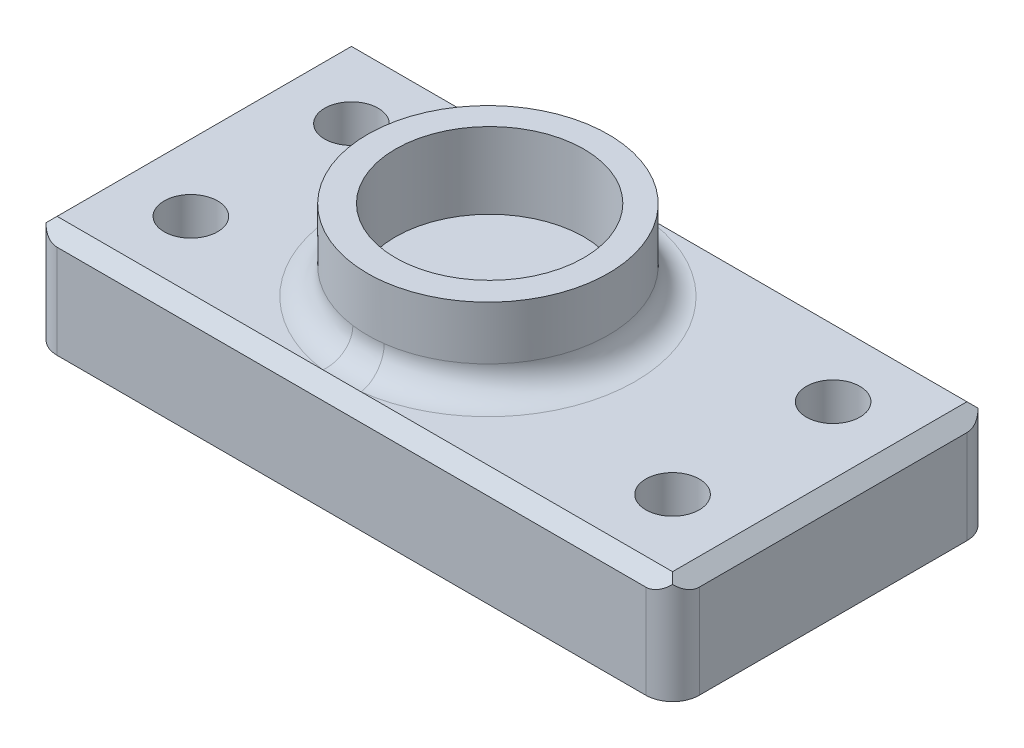
ISO-10303-21;
HEADER;
FILE_DESCRIPTION(('STEP AP214'),'2;1');
FILE_NAME('part.step','',(''),(''),'','','');
FILE_SCHEMA(('AUTOMOTIVE_DESIGN { 1 0 10303 214 1 1 1 1 }'));
ENDSEC;
DATA;
#1=APPLICATION_CONTEXT('core data for automotive mechanical design processes');
#2=APPLICATION_PROTOCOL_DEFINITION('international standard','automotive_design',2000,#1);
#3=PRODUCT_CONTEXT('',#1,'mechanical');
#4=PRODUCT('Part','Part','',(#3));
#5=PRODUCT_RELATED_PRODUCT_CATEGORY('part','',(#4));
#6=PRODUCT_DEFINITION_FORMATION('','',#4);
#7=PRODUCT_DEFINITION_CONTEXT('part definition',#1,'design');
#8=PRODUCT_DEFINITION('design','',#6,#7);
#9=PRODUCT_DEFINITION_SHAPE('','',#8);
#10=(LENGTH_UNIT() NAMED_UNIT(*) SI_UNIT(.MILLI.,.METRE.));
#11=(NAMED_UNIT(*) PLANE_ANGLE_UNIT() SI_UNIT($,.RADIAN.));
#12=(NAMED_UNIT(*) SI_UNIT($,.STERADIAN.) SOLID_ANGLE_UNIT());
#13=UNCERTAINTY_MEASURE_WITH_UNIT(LENGTH_MEASURE(1.E-05),#10,'distance_accuracy_value','');
#14=(GEOMETRIC_REPRESENTATION_CONTEXT(3) GLOBAL_UNCERTAINTY_ASSIGNED_CONTEXT((#13)) GLOBAL_UNIT_ASSIGNED_CONTEXT((#10,
#11,#12)) REPRESENTATION_CONTEXT('',''));
#15=CARTESIAN_POINT('',(0.,0.,0.));
#16=DIRECTION('',(0.,0.,1.));
#17=DIRECTION('',(1.,0.,0.));
#18=AXIS2_PLACEMENT_3D('',#15,#16,#17);
#19=CARTESIAN_POINT('',(-69.4579913046078,25.4,-42.0897293171965));
#20=DIRECTION('',(1.,0.,0.));
#21=DIRECTION('',(0.,0.,-1.));
#22=AXIS2_PLACEMENT_3D('',#19,#20,#21);
#23=PLANE('',#22);
#24=DIRECTION('',(0.,0.,-1.));
#25=VECTOR('',#24,1.);
#26=CARTESIAN_POINT('',(-69.4579913046078,22.225,-42.0897293171965));
#27=LINE('',#26,#25);
#28=CARTESIAN_POINT('',(-69.4579913046078,22.225,27.7602706828035));
#29=VERTEX_POINT('',#28);
#30=CARTESIAN_POINT('',(-69.4579913046078,22.225,-35.7397293171965));
#31=VERTEX_POINT('',#30);
#32=EDGE_CURVE('E185',#29,#31,#27,.T.);
#33=ORIENTED_EDGE('',*,*,#32,.T.);
#34=DIRECTION('',(0.,-1.,0.));
#35=VECTOR('',#34,1.);
#36=CARTESIAN_POINT('',(-69.4579913046078,25.4,-35.7397293171965));
#37=LINE('',#36,#35);
#38=CARTESIAN_POINT('',(-69.4579913046078,0.,-35.7397293171965));
#39=VERTEX_POINT('',#38);
#40=EDGE_CURVE('E318',#31,#39,#37,.T.);
#41=ORIENTED_EDGE('',*,*,#40,.T.);
#42=DIRECTION('',(0.,0.,1.));
#43=VECTOR('',#42,1.);
#44=CARTESIAN_POINT('',(-69.4579913046078,0.,-42.0897293171965));
#45=LINE('',#44,#43);
#46=CARTESIAN_POINT('',(-69.4579913046078,0.,27.7602706828034));
#47=VERTEX_POINT('',#46);
#48=EDGE_CURVE('E384',#39,#47,#45,.T.);
#49=ORIENTED_EDGE('',*,*,#48,.T.);
#50=DIRECTION('',(0.,-1.,0.));
#51=VECTOR('',#50,1.);
#52=CARTESIAN_POINT('',(-69.4579913046078,25.4,27.7602706828035));
#53=LINE('',#52,#51);
#54=EDGE_CURVE('E321',#47,#29,#53,.F.);
#55=ORIENTED_EDGE('',*,*,#54,.T.);
#56=EDGE_LOOP('',(#33,#41,#49,#55));
#57=FACE_BOUND('',#56,.T.);
#58=ADVANCED_FACE('F45',(#57),#23,.F.);
#59=CARTESIAN_POINT('',(-69.4579913046078,25.4,34.1102706828035));
#60=DIRECTION('',(0.,0.,-1.));
#61=DIRECTION('',(-1.,0.,0.));
#62=AXIS2_PLACEMENT_3D('',#59,#60,#61);
#63=PLANE('',#62);
#64=DIRECTION('',(-1.,0.,0.));
#65=VECTOR('',#64,1.);
#66=CARTESIAN_POINT('',(-69.4579913046078,22.225,34.1102706828035));
#67=LINE('',#66,#65);
#68=CARTESIAN_POINT('',(76.5920086953922,22.225,34.1102706828035));
#69=VERTEX_POINT('',#68);
#70=CARTESIAN_POINT('',(-63.1079913046079,22.225,34.1102706828035));
#71=VERTEX_POINT('',#70);
#72=EDGE_CURVE('E202',#69,#71,#67,.T.);
#73=ORIENTED_EDGE('',*,*,#72,.T.);
#74=DIRECTION('',(0.,-1.,0.));
#75=VECTOR('',#74,1.);
#76=CARTESIAN_POINT('',(-63.1079913046079,25.4,34.1102706828035));
#77=LINE('',#76,#75);
#78=CARTESIAN_POINT('',(-63.1079913046079,0.,34.1102706828035));
#79=VERTEX_POINT('',#78);
#80=EDGE_CURVE('E307',#71,#79,#77,.T.);
#81=ORIENTED_EDGE('',*,*,#80,.T.);
#82=DIRECTION('',(1.,0.,0.));
#83=VECTOR('',#82,1.);
#84=CARTESIAN_POINT('',(-69.4579913046078,0.,34.1102706828035));
#85=LINE('',#84,#83);
#86=CARTESIAN_POINT('',(76.5920086953921,0.,34.1102706828035));
#87=VERTEX_POINT('',#86);
#88=EDGE_CURVE('E390',#79,#87,#85,.T.);
#89=ORIENTED_EDGE('',*,*,#88,.T.);
#90=DIRECTION('',(0.,-1.,0.));
#91=VECTOR('',#90,1.);
#92=CARTESIAN_POINT('',(76.5920086953922,25.4,34.1102706828035));
#93=LINE('',#92,#91);
#94=EDGE_CURVE('E74',#87,#69,#93,.F.);
#95=ORIENTED_EDGE('',*,*,#94,.T.);
#96=EDGE_LOOP('',(#73,#81,#89,#95));
#97=FACE_BOUND('',#96,.T.);
#98=ADVANCED_FACE('F421',(#97),#63,.F.);
#99=CARTESIAN_POINT('',(82.9420086953922,25.4,-42.0897293171965));
#100=DIRECTION('',(-1.,0.,0.));
#101=DIRECTION('',(0.,0.,1.));
#102=AXIS2_PLACEMENT_3D('',#99,#100,#101);
#103=PLANE('',#102);
#104=DIRECTION('',(0.,0.,-1.));
#105=VECTOR('',#104,1.);
#106=CARTESIAN_POINT('',(82.9420086953922,0.,-42.0897293171965));
#107=LINE('',#106,#105);
#108=CARTESIAN_POINT('',(82.9420086953922,0.,27.7602706828034));
#109=VERTEX_POINT('',#108);
#110=CARTESIAN_POINT('',(82.9420086953922,0.,-35.7397293171965));
#111=VERTEX_POINT('',#110);
#112=EDGE_CURVE('E393',#109,#111,#107,.T.);
#113=ORIENTED_EDGE('',*,*,#112,.T.);
#114=DIRECTION('',(0.,-1.,0.));
#115=VECTOR('',#114,1.);
#116=CARTESIAN_POINT('',(82.9420086953922,25.4,-35.7397293171965));
#117=LINE('',#116,#115);
#118=CARTESIAN_POINT('',(82.9420086953922,22.225,-35.7397293171965));
#119=VERTEX_POINT('',#118);
#120=EDGE_CURVE('E239',#111,#119,#117,.F.);
#121=ORIENTED_EDGE('',*,*,#120,.T.);
#122=DIRECTION('',(0.,0.,1.));
#123=VECTOR('',#122,1.);
#124=CARTESIAN_POINT('',(82.9420086953922,22.225,34.1102706828035));
#125=LINE('',#124,#123);
#126=CARTESIAN_POINT('',(82.9420086953922,22.225,27.7602706828035));
#127=VERTEX_POINT('',#126);
#128=EDGE_CURVE('E198',#119,#127,#125,.T.);
#129=ORIENTED_EDGE('',*,*,#128,.T.);
#130=DIRECTION('',(0.,-1.,0.));
#131=VECTOR('',#130,1.);
#132=CARTESIAN_POINT('',(82.9420086953922,25.4,27.7602706828035));
#133=LINE('',#132,#131);
#134=EDGE_CURVE('E235',#127,#109,#133,.T.);
#135=ORIENTED_EDGE('',*,*,#134,.T.);
#136=EDGE_LOOP('',(#113,#121,#129,#135));
#137=FACE_BOUND('',#136,.T.);
#138=ADVANCED_FACE('F427',(#137),#103,.F.);
#139=CARTESIAN_POINT('',(-69.4579913046078,25.4,-42.0897293171965));
#140=DIRECTION('',(0.,0.,1.));
#141=DIRECTION('',(1.,0.,0.));
#142=AXIS2_PLACEMENT_3D('',#139,#140,#141);
#143=PLANE('',#142);
#144=DIRECTION('',(1.,0.,0.));
#145=VECTOR('',#144,1.);
#146=CARTESIAN_POINT('',(82.9420086953922,22.225,-42.0897293171965));
#147=LINE('',#146,#145);
#148=CARTESIAN_POINT('',(-63.1079913046079,22.225,-42.0897293171965));
#149=VERTEX_POINT('',#148);
#150=CARTESIAN_POINT('',(76.5920086953922,22.225,-42.0897293171965));
#151=VERTEX_POINT('',#150);
#152=EDGE_CURVE('E190',#149,#151,#147,.T.);
#153=ORIENTED_EDGE('',*,*,#152,.T.);
#154=DIRECTION('',(0.,-1.,0.));
#155=VECTOR('',#154,1.);
#156=CARTESIAN_POINT('',(76.5920086953922,25.4,-42.0897293171965));
#157=LINE('',#156,#155);
#158=CARTESIAN_POINT('',(76.5920086953921,0.,-42.0897293171965));
#159=VERTEX_POINT('',#158);
#160=EDGE_CURVE('E219',#151,#159,#157,.T.);
#161=ORIENTED_EDGE('',*,*,#160,.T.);
#162=DIRECTION('',(-1.,0.,0.));
#163=VECTOR('',#162,1.);
#164=CARTESIAN_POINT('',(-69.4579913046078,0.,-42.0897293171965));
#165=LINE('',#164,#163);
#166=CARTESIAN_POINT('',(-63.1079913046079,0.,-42.0897293171965));
#167=VERTEX_POINT('',#166);
#168=EDGE_CURVE('E334',#159,#167,#165,.T.);
#169=ORIENTED_EDGE('',*,*,#168,.T.);
#170=DIRECTION('',(0.,-1.,0.));
#171=VECTOR('',#170,1.);
#172=CARTESIAN_POINT('',(-63.1079913046079,25.4,-42.0897293171965));
#173=LINE('',#172,#171);
#174=EDGE_CURVE('E204',#167,#149,#173,.F.);
#175=ORIENTED_EDGE('',*,*,#174,.T.);
#176=EDGE_LOOP('',(#153,#161,#169,#175));
#177=FACE_BOUND('',#176,.T.);
#178=ADVANCED_FACE('F433',(#177),#143,.F.);
#179=CARTESIAN_POINT('',(0.,25.4,0.));
#180=DIRECTION('',(0.,1.,0.));
#181=DIRECTION('',(0.,0.,1.));
#182=AXIS2_PLACEMENT_3D('',#179,#180,#181);
#183=PLANE('',#182);
#184=DIRECTION('',(1.,0.,0.));
#185=VECTOR('',#184,1.);
#186=CARTESIAN_POINT('',(82.9420086953922,25.4,30.9352706828035));
#187=LINE('',#186,#185);
#188=CARTESIAN_POINT('',(-66.2829913046078,25.4,30.9352706828035));
#189=VERTEX_POINT('',#188);
#190=CARTESIAN_POINT('',(-3.21481026973823,25.4,30.9352706828035));
#191=VERTEX_POINT('',#190);
#192=EDGE_CURVE('E169',#189,#191,#187,.T.);
#193=ORIENTED_EDGE('',*,*,#192,.T.);
#194=CARTESIAN_POINT('',(1.32772290289185,25.4,-3.69305612308706));
#195=DIRECTION('',(0.,1.,0.));
#196=DIRECTION('',(0.,0.,1.));
#197=AXIS2_PLACEMENT_3D('',#194,#195,#196);
#198=CIRCLE('',#197,34.925);
#199=CARTESIAN_POINT('',(5.87025607552193,25.4,30.9352706828035));
#200=VERTEX_POINT('',#199);
#201=EDGE_CURVE('E267',#191,#200,#198,.F.);
#202=ORIENTED_EDGE('',*,*,#201,.T.);
#203=CARTESIAN_POINT('',(79.7670086953921,25.4,30.9352706828035));
#204=VERTEX_POINT('',#203);
#205=EDGE_CURVE('E178',#200,#204,#187,.T.);
#206=ORIENTED_EDGE('',*,*,#205,.T.);
#207=DIRECTION('',(0.,0.,-1.));
#208=VECTOR('',#207,1.);
#209=CARTESIAN_POINT('',(79.7670086953921,25.4,-42.0897293171965));
#210=LINE('',#209,#208);
#211=CARTESIAN_POINT('',(79.7670086953921,25.4,-38.9147293171965));
#212=VERTEX_POINT('',#211);
#213=EDGE_CURVE('E176',#204,#212,#210,.T.);
#214=ORIENTED_EDGE('',*,*,#213,.T.);
#215=DIRECTION('',(-1.,0.,0.));
#216=VECTOR('',#215,1.);
#217=CARTESIAN_POINT('',(-69.4579913046078,25.4,-38.9147293171965));
#218=LINE('',#217,#216);
#219=CARTESIAN_POINT('',(-66.2829913046078,25.4,-38.9147293171965));
#220=VERTEX_POINT('',#219);
#221=EDGE_CURVE('E182',#212,#220,#218,.T.);
#222=ORIENTED_EDGE('',*,*,#221,.T.);
#223=DIRECTION('',(0.,0.,1.));
#224=VECTOR('',#223,1.);
#225=CARTESIAN_POINT('',(-66.2829913046078,25.4,34.1102706828035));
#226=LINE('',#225,#224);
#227=EDGE_CURVE('E159',#220,#189,#226,.T.);
#228=ORIENTED_EDGE('',*,*,#227,.T.);
#229=EDGE_LOOP('',(#193,#202,#206,#214,#222,#228));
#230=FACE_BOUND('',#229,.T.);
#231=CARTESIAN_POINT('',(-50.4079913046079,25.4,15.0602706828035));
#232=DIRECTION('',(0.,1.,0.));
#233=DIRECTION('',(0.,0.,1.));
#234=AXIS2_PLACEMENT_3D('',#231,#232,#233);
#235=CIRCLE('',#234,6.35);
#236=CARTESIAN_POINT('',(-50.4079913046079,25.4,21.4102706828035));
#237=VERTEX_POINT('',#236);
#238=EDGE_CURVE('E369',#237,#237,#235,.T.);
#239=ORIENTED_EDGE('',*,*,#238,.F.);
#240=EDGE_LOOP('',(#239));
#241=FACE_BOUND('',#240,.T.);
#242=CARTESIAN_POINT('',(63.8920086953922,25.4,-23.0397293171965));
#243=DIRECTION('',(0.,1.,0.));
#244=DIRECTION('',(0.,0.,1.));
#245=AXIS2_PLACEMENT_3D('',#242,#243,#244);
#246=CIRCLE('',#245,6.35);
#247=CARTESIAN_POINT('',(63.8920086953922,25.4,-16.6897293171965));
#248=VERTEX_POINT('',#247);
#249=EDGE_CURVE('E362',#248,#248,#246,.T.);
#250=ORIENTED_EDGE('',*,*,#249,.F.);
#251=EDGE_LOOP('',(#250));
#252=FACE_BOUND('',#251,.T.);
#253=CARTESIAN_POINT('',(63.8920086953922,25.4,15.0602706828035));
#254=DIRECTION('',(0.,1.,0.));
#255=DIRECTION('',(0.,0.,1.));
#256=AXIS2_PLACEMENT_3D('',#253,#254,#255);
#257=CIRCLE('',#256,6.35);
#258=CARTESIAN_POINT('',(63.8920086953922,25.4,21.4102706828035));
#259=VERTEX_POINT('',#258);
#260=EDGE_CURVE('E348',#259,#259,#257,.T.);
#261=ORIENTED_EDGE('',*,*,#260,.F.);
#262=EDGE_LOOP('',(#261));
#263=FACE_BOUND('',#262,.T.);
#264=CARTESIAN_POINT('',(-50.4079913046079,25.4,-23.0397293171965));
#265=DIRECTION('',(0.,1.,0.));
#266=DIRECTION('',(0.,0.,1.));
#267=AXIS2_PLACEMENT_3D('',#264,#265,#266);
#268=CIRCLE('',#267,6.35);
#269=CARTESIAN_POINT('',(-50.4079913046079,25.4,-16.6897293171965));
#270=VERTEX_POINT('',#269);
#271=EDGE_CURVE('E368',#270,#270,#268,.T.);
#272=ORIENTED_EDGE('',*,*,#271,.F.);
#273=EDGE_LOOP('',(#272));
#274=FACE_BOUND('',#273,.T.);
#275=ADVANCED_FACE('F179',(#230,#241,#252,#263,#274),#183,.T.);
#276=CARTESIAN_POINT('',(0.,0.,0.));
#277=DIRECTION('',(0.,1.,0.));
#278=DIRECTION('',(0.,0.,1.));
#279=AXIS2_PLACEMENT_3D('',#276,#277,#278);
#280=PLANE('',#279);
#281=CARTESIAN_POINT('',(-50.4079913046079,0.,15.0602706828035));
#282=DIRECTION('',(0.,1.,0.));
#283=DIRECTION('',(0.,0.,1.));
#284=AXIS2_PLACEMENT_3D('',#281,#282,#283);
#285=CIRCLE('',#284,6.35);
#286=CARTESIAN_POINT('',(-50.4079913046079,0.,21.4102706828035));
#287=VERTEX_POINT('',#286);
#288=EDGE_CURVE('E364',#287,#287,#285,.T.);
#289=ORIENTED_EDGE('',*,*,#288,.T.);
#290=EDGE_LOOP('',(#289));
#291=FACE_BOUND('',#290,.T.);
#292=CARTESIAN_POINT('',(63.8920086953922,0.,-23.0397293171965));
#293=DIRECTION('',(0.,1.,0.));
#294=DIRECTION('',(0.,0.,1.));
#295=AXIS2_PLACEMENT_3D('',#292,#293,#294);
#296=CIRCLE('',#295,6.35);
#297=CARTESIAN_POINT('',(63.8920086953922,0.,-16.6897293171965));
#298=VERTEX_POINT('',#297);
#299=EDGE_CURVE('E373',#298,#298,#296,.T.);
#300=ORIENTED_EDGE('',*,*,#299,.T.);
#301=EDGE_LOOP('',(#300));
#302=FACE_BOUND('',#301,.T.);
#303=CARTESIAN_POINT('',(63.8920086953922,0.,15.0602706828035));
#304=DIRECTION('',(0.,1.,0.));
#305=DIRECTION('',(0.,0.,1.));
#306=AXIS2_PLACEMENT_3D('',#303,#304,#305);
#307=CIRCLE('',#306,6.35);
#308=CARTESIAN_POINT('',(63.8920086953922,0.,21.4102706828035));
#309=VERTEX_POINT('',#308);
#310=EDGE_CURVE('E354',#309,#309,#307,.T.);
#311=ORIENTED_EDGE('',*,*,#310,.T.);
#312=EDGE_LOOP('',(#311));
#313=FACE_BOUND('',#312,.T.);
#314=CARTESIAN_POINT('',(-50.4079913046079,0.,-23.0397293171965));
#315=DIRECTION('',(0.,1.,0.));
#316=DIRECTION('',(0.,0.,1.));
#317=AXIS2_PLACEMENT_3D('',#314,#315,#316);
#318=CIRCLE('',#317,6.35);
#319=CARTESIAN_POINT('',(-50.4079913046079,0.,-16.6897293171965));
#320=VERTEX_POINT('',#319);
#321=EDGE_CURVE('E380',#320,#320,#318,.T.);
#322=ORIENTED_EDGE('',*,*,#321,.T.);
#323=EDGE_LOOP('',(#322));
#324=FACE_BOUND('',#323,.T.);
#325=ORIENTED_EDGE('',*,*,#168,.F.);
#326=CARTESIAN_POINT('',(76.5920086953922,0.,-35.7397293171965));
#327=DIRECTION('',(0.,1.,0.));
#328=DIRECTION('',(0.,0.,1.));
#329=AXIS2_PLACEMENT_3D('',#326,#327,#328);
#330=CIRCLE('',#329,6.35);
#331=EDGE_CURVE('E232',#159,#111,#330,.F.);
#332=ORIENTED_EDGE('',*,*,#331,.T.);
#333=ORIENTED_EDGE('',*,*,#112,.F.);
#334=CARTESIAN_POINT('',(76.5920086953922,0.,27.7602706828035));
#335=DIRECTION('',(0.,1.,0.));
#336=DIRECTION('',(0.,0.,1.));
#337=AXIS2_PLACEMENT_3D('',#334,#335,#336);
#338=CIRCLE('',#337,6.35);
#339=EDGE_CURVE('E223',#109,#87,#338,.F.);
#340=ORIENTED_EDGE('',*,*,#339,.T.);
#341=ORIENTED_EDGE('',*,*,#88,.F.);
#342=CARTESIAN_POINT('',(-63.1079913046079,0.,27.7602706828035));
#343=DIRECTION('',(0.,1.,0.));
#344=DIRECTION('',(0.,0.,1.));
#345=AXIS2_PLACEMENT_3D('',#342,#343,#344);
#346=CIRCLE('',#345,6.35);
#347=EDGE_CURVE('E226',#79,#47,#346,.F.);
#348=ORIENTED_EDGE('',*,*,#347,.T.);
#349=ORIENTED_EDGE('',*,*,#48,.F.);
#350=CARTESIAN_POINT('',(-63.1079913046079,0.,-35.7397293171965));
#351=DIRECTION('',(0.,1.,0.));
#352=DIRECTION('',(0.,0.,1.));
#353=AXIS2_PLACEMENT_3D('',#350,#351,#352);
#354=CIRCLE('',#353,6.35);
#355=EDGE_CURVE('E229',#39,#167,#354,.F.);
#356=ORIENTED_EDGE('',*,*,#355,.T.);
#357=EDGE_LOOP('',(#325,#332,#333,#340,#341,#348,#349,#356));
#358=FACE_BOUND('',#357,.T.);
#359=ADVANCED_FACE('F416',(#291,#302,#313,#324,#358),#280,.F.);
#360=CARTESIAN_POINT('',(-50.4079913046079,0.,-23.0397293171965));
#361=DIRECTION('',(0.,1.,0.));
#362=DIRECTION('',(0.,0.,1.));
#363=AXIS2_PLACEMENT_3D('',#360,#361,#362);
#364=CYLINDRICAL_SURFACE('',#363,6.35);
#365=ORIENTED_EDGE('',*,*,#321,.F.);
#366=EDGE_LOOP('',(#365));
#367=FACE_BOUND('',#366,.T.);
#368=ORIENTED_EDGE('',*,*,#271,.T.);
#369=EDGE_LOOP('',(#368));
#370=FACE_BOUND('',#369,.T.);
#371=ADVANCED_FACE('F533',(#367,#370),#364,.F.);
#372=CARTESIAN_POINT('',(63.8920086953922,0.,15.0602706828035));
#373=DIRECTION('',(0.,1.,0.));
#374=DIRECTION('',(0.,0.,1.));
#375=AXIS2_PLACEMENT_3D('',#372,#373,#374);
#376=CYLINDRICAL_SURFACE('',#375,6.35);
#377=ORIENTED_EDGE('',*,*,#310,.F.);
#378=EDGE_LOOP('',(#377));
#379=FACE_BOUND('',#378,.T.);
#380=ORIENTED_EDGE('',*,*,#260,.T.);
#381=EDGE_LOOP('',(#380));
#382=FACE_BOUND('',#381,.T.);
#383=ADVANCED_FACE('F555',(#379,#382),#376,.F.);
#384=CARTESIAN_POINT('',(63.8920086953922,0.,-23.0397293171965));
#385=DIRECTION('',(0.,1.,0.));
#386=DIRECTION('',(0.,0.,1.));
#387=AXIS2_PLACEMENT_3D('',#384,#385,#386);
#388=CYLINDRICAL_SURFACE('',#387,6.35);
#389=ORIENTED_EDGE('',*,*,#299,.F.);
#390=EDGE_LOOP('',(#389));
#391=FACE_BOUND('',#390,.T.);
#392=ORIENTED_EDGE('',*,*,#249,.T.);
#393=EDGE_LOOP('',(#392));
#394=FACE_BOUND('',#393,.T.);
#395=ADVANCED_FACE('F563',(#391,#394),#388,.F.);
#396=CARTESIAN_POINT('',(-50.4079913046079,0.,15.0602706828035));
#397=DIRECTION('',(0.,1.,0.));
#398=DIRECTION('',(0.,0.,1.));
#399=AXIS2_PLACEMENT_3D('',#396,#397,#398);
#400=CYLINDRICAL_SURFACE('',#399,6.35);
#401=ORIENTED_EDGE('',*,*,#288,.F.);
#402=EDGE_LOOP('',(#401));
#403=FACE_BOUND('',#402,.T.);
#404=ORIENTED_EDGE('',*,*,#238,.T.);
#405=EDGE_LOOP('',(#404));
#406=FACE_BOUND('',#405,.T.);
#407=ADVANCED_FACE('F342',(#403,#406),#400,.F.);
#408=CARTESIAN_POINT('',(1.32772290289185,44.45,-3.69305612308706));
#409=DIRECTION('',(0.,-1.,0.));
#410=DIRECTION('',(0.,0.,-1.));
#411=AXIS2_PLACEMENT_3D('',#408,#409,#410);
#412=CYLINDRICAL_SURFACE('',#411,28.575);
#413=CARTESIAN_POINT('',(1.32772290289185,31.75,-3.69305612308706));
#414=DIRECTION('',(0.,1.,0.));
#415=DIRECTION('',(0.,0.,1.));
#416=AXIS2_PLACEMENT_3D('',#413,#414,#415);
#417=CIRCLE('',#416,28.575);
#418=CARTESIAN_POINT('',(5.04434095322555,31.75,24.6392112635506));
#419=VERTEX_POINT('',#418);
#420=CARTESIAN_POINT('',(-2.38889514744186,31.75,24.6392112635506));
#421=VERTEX_POINT('',#420);
#422=EDGE_CURVE('E254',#419,#421,#417,.T.);
#423=ORIENTED_EDGE('',*,*,#422,.T.);
#424=CARTESIAN_POINT('',(-6.2624174510975,31.6773304826748,23.8554537169522));
#425=CARTESIAN_POINT('',(-5.97536421889927,24.3316829936399,23.9345423621858));
#426=CARTESIAN_POINT('',(-7.94911530753958,25.4,30.9352706828035));
#427=CARTESIAN_POINT('',(-5.87897522306729,31.6969180649296,23.9611087342384));
#428=CARTESIAN_POINT('',(-5.65392009005018,24.4903819957808,24.0190937761306));
#429=CARTESIAN_POINT('',(-7.48046369548943,25.4,30.9352706828035));
#430=CARTESIAN_POINT('',(-5.49319688214355,31.7111749942436,24.0587757113627));
#431=CARTESIAN_POINT('',(-5.31409674128743,24.6324543772818,24.1023656961951));
#432=CARTESIAN_POINT('',(-7.0089568343659,25.4,30.9352706828035));
#433=CARTESIAN_POINT('',(-4.71780957692108,31.7320174591437,24.2379361999547));
#434=CARTESIAN_POINT('',(-4.61339676458064,24.8834331189676,24.2598964434049));
#435=CARTESIAN_POINT('',(-6.06126123911103,25.4,30.9352706828035));
#436=CARTESIAN_POINT('',(-4.32820109742514,31.738603953328,24.319431731362));
#437=CARTESIAN_POINT('',(-4.25172293059041,24.993357289891,24.3345817753255));
#438=CARTESIAN_POINT('',(-5.58507309751645,25.4,30.9352706828035));
#439=CARTESIAN_POINT('',(-3.54602670304103,31.7470974729515,24.4660544840629));
#440=CARTESIAN_POINT('',(-3.51338816496298,25.1848369432757,24.4713706097458));
#441=CARTESIAN_POINT('',(-4.62908217104482,25.4,30.9352706828035));
#442=CARTESIAN_POINT('',(-3.15346179628641,31.7490060269875,24.5311870459905));
#443=CARTESIAN_POINT('',(-3.13574895486982,25.2671152463945,24.5338787234635));
#444=CARTESIAN_POINT('',(-4.14928061833103,25.4,30.9352706828035));
#445=CARTESIAN_POINT('',(-2.36594168828603,31.7503793165608,24.6450056385877));
#446=CARTESIAN_POINT('',(-2.36997578815105,25.4072464534914,24.6442923578275));
#447=CARTESIAN_POINT('',(-3.1867560418761,25.4,30.9352706828035));
#448=CARTESIAN_POINT('',(-1.97098642254757,31.7498439858652,24.6936912234808));
#449=CARTESIAN_POINT('',(-1.98074020288179,25.465585267753,24.6925306363788));
#450=CARTESIAN_POINT('',(-2.70403293931056,25.4,30.9352706828035));
#451=CARTESIAN_POINT('',(-1.19006502128749,31.7480616416417,24.7734371989972));
#452=CARTESIAN_POINT('',(-1.20616339669828,25.5593959322419,24.7719521892761));
#453=CARTESIAN_POINT('',(-1.74957344888418,25.4,30.9352706828035));
#454=CARTESIAN_POINT('',(-0.804143676874773,31.7468342082833,24.8049374611878));
#455=CARTESIAN_POINT('',(-0.819980428479548,25.5957243987229,24.8037830311191));
#456=CARTESIAN_POINT('',(-1.27789180571214,25.4,30.9352706828035));
#457=CARTESIAN_POINT('',(-0.0313392820995467,31.7447264656545,24.8522313725286));
#458=CARTESIAN_POINT('',(-0.0444463636128284,25.6496880404032,24.8516136854666));
#459=CARTESIAN_POINT('',(-0.333353100986178,25.4,30.9352706828035));
#460=CARTESIAN_POINT('',(0.355543765570938,31.7438461554135,24.8680250655957));
#461=CARTESIAN_POINT('',(0.346025655893967,25.6674844176349,24.8677531337672));
#462=CARTESIAN_POINT('',(0.139503957277492,25.4,30.9352706828035));
#463=CARTESIAN_POINT('',(1.12968410060868,31.742962138183,24.8838805920441));
#464=CARTESIAN_POINT('',(1.12729656094165,25.6852978052027,24.8839085759515));
#465=CARTESIAN_POINT('',(1.08567547787899,25.4,30.9352706828035));
#466=CARTESIAN_POINT('',(1.51694143078748,31.7429585474137,24.8839403396923));
#467=CARTESIAN_POINT('',(1.51923513073107,25.6853645966855,24.8839697161849));
#468=CARTESIAN_POINT('',(1.55898999254204,25.4,30.9352706828035));
#469=CARTESIAN_POINT('',(2.29114180001205,31.743829807023,24.8683226707549));
#470=CARTESIAN_POINT('',(2.30058306775974,25.6678194688899,24.8680564581964));
#471=CARTESIAN_POINT('',(2.505234888261,25.4,30.9352706828035));
#472=CARTESIAN_POINT('',(2.67808483557132,31.7447046670167,24.8526450819167));
#473=CARTESIAN_POINT('',(2.69113214362619,25.6501560060338,24.8520353088157));
#474=CARTESIAN_POINT('',(2.97816526505564,25.4,30.9352706828035));
#475=CARTESIAN_POINT('',(3.4559451287158,31.7468223521233,24.80527808872));
#476=CARTESIAN_POINT('',(3.47181187615464,25.5961167401157,24.8041239859989));
#477=CARTESIAN_POINT('',(3.92888340112113,25.4,30.9352706828035));
#478=CARTESIAN_POINT('',(3.84685010681386,31.748069729409,24.7733869541687));
#479=CARTESIAN_POINT('',(3.86300931535137,25.5593408893904,24.7718916854723));
#480=CARTESIAN_POINT('',(4.40665615212991,25.4,30.9352706828035));
#481=CARTESIAN_POINT('',(4.62701203048033,31.7498401837904,24.6935440901727));
#482=CARTESIAN_POINT('',(4.63668832339258,25.4654071876209,24.6923941205265));
#483=CARTESIAN_POINT('',(5.36018739216662,25.4,30.9352706828035));
#484=CARTESIAN_POINT('',(5.01626899928674,31.7503632711331,24.6455925879583));
#485=CARTESIAN_POINT('',(5.02029423554921,25.4079502681124,24.6448925563951));
#486=CARTESIAN_POINT('',(5.83594590959654,25.4,30.9352706828035));
#487=CARTESIAN_POINT('',(5.79233621489822,31.7490591416498,24.5337306515451));
#488=CARTESIAN_POINT('',(5.77509778759244,25.2702912785221,24.5363364724679));
#489=CARTESIAN_POINT('',(6.78447250645536,25.4,30.9352706828035));
#490=CARTESIAN_POINT('',(6.17914731455322,31.7472327952923,24.4698261350292));
#491=CARTESIAN_POINT('',(6.1473555860616,25.1896336656075,24.4749686764486));
#492=CARTESIAN_POINT('',(7.25724162825639,25.4,30.9352706828035));
#493=CARTESIAN_POINT('',(6.9497806385726,31.7390718563811,24.3261643892461));
#494=CARTESIAN_POINT('',(6.87540278363419,25.0023242646615,24.3408251578426));
#495=CARTESIAN_POINT('',(8.19912680205659,25.4,30.9352706828035));
#496=CARTESIAN_POINT('',(7.33360291025067,31.7327373353399,24.2464074114586));
#497=CARTESIAN_POINT('',(7.23213731699184,24.8949965044059,24.2676685270362));
#498=CARTESIAN_POINT('',(8.66824291188361,25.4,30.9352706828035));
#499=CARTESIAN_POINT('',(8.10856870166042,31.7125654088884,24.0686676741575));
#500=CARTESIAN_POINT('',(7.93409390168224,24.646628814737,24.1107893523732));
#501=CARTESIAN_POINT('',(9.61542332361143,25.4,30.9352706828035));
#502=CARTESIAN_POINT('',(8.4996036316854,31.6985166522143,23.9702251686631));
#503=CARTESIAN_POINT('',(8.27933290626452,24.5037408102853,24.0264224912211));
#504=CARTESIAN_POINT('',(10.0933549047598,25.4,30.9352706828035));
#505=CARTESIAN_POINT('',(9.27673909021559,31.6591732625174,23.7570092124321));
#506=CARTESIAN_POINT('',(8.93932491644969,24.1807532934001,23.8539145459824));
#507=CARTESIAN_POINT('',(11.0431871318364,25.4,30.9352706828035));
#508=CARTESIAN_POINT('',(9.66284064214823,31.6338810022404,23.6422392108024));
#509=CARTESIAN_POINT('',(9.25462398674387,23.9991988806855,23.7653632065693));
#510=CARTESIAN_POINT('',(11.5150890286202,25.4,30.9352706828035));
#511=CARTESIAN_POINT('',(10.4298562800269,31.5675992244602,23.396502918816));
#512=CARTESIAN_POINT('',(9.84527663439941,23.5922169950679,23.5916734976476));
#513=CARTESIAN_POINT('',(12.4525525860864,25.4,30.9352706828035));
#514=CARTESIAN_POINT('',(10.8107586963337,31.5265789933732,23.2655052800929));
#515=CARTESIAN_POINT('',(10.1205753381679,23.3646828775235,23.5063009605994));
#516=CARTESIAN_POINT('',(12.9180999838764,25.4,30.9352706828035));
#517=CARTESIAN_POINT('',(11.3765725513186,31.4492154646782,23.0574896003872));
#518=CARTESIAN_POINT('',(10.4890802273766,22.9889579242904,23.390406608815));
#519=CARTESIAN_POINT('',(13.6096502510387,25.4,30.9352706828035));
#520=CARTESIAN_POINT('',(11.5643318117783,31.4207734339944,22.9861987034923));
#521=CARTESIAN_POINT('',(10.6058993587861,22.8558878981111,23.3533496966974));
#522=CARTESIAN_POINT('',(13.8391337915594,25.4,30.9352706828035));
#523=CARTESIAN_POINT('',(11.9377447585345,31.3577852164748,22.8399102572922));
#524=CARTESIAN_POINT('',(10.8231054535195,22.576267013161,23.2850632279784));
#525=CARTESIAN_POINT('',(14.295527393095,25.4,30.9352706828035));
#526=CARTESIAN_POINT('',(12.1233980654999,31.3232379479566,22.7649120528515));
#527=CARTESIAN_POINT('',(10.9233085426087,22.4293204993492,23.2539035532048));
#528=CARTESIAN_POINT('',(14.5224369904832,25.4,30.9352706828035));
#529=CARTESIAN_POINT('',(12.3078636583762,31.2852304957211,22.6881328946534));
#530=CARTESIAN_POINT('',(11.0129377553071,22.2767050324145,23.2270952846374));
#531=CARTESIAN_POINT('',(14.7478949373727,25.4,30.9352706828035));
#532=(BOUNDED_SURFACE() B_SPLINE_SURFACE(3,2,((#424,#425,#426),(#427,#428,#429),(#430,#431,
#432),(#433,#434,#435),(#436,#437,#438),(#439,#440,#441),(#442,#443,#444),(#445,#446,#447),
(#448,#449,#450),(#451,#452,#453),(#454,#455,#456),(#457,#458,#459),(#460,#461,#462),(#463,#464,
#465),(#466,#467,#468),(#469,#470,#471),(#472,#473,#474),(#475,#476,#477),(#478,#479,#480),
(#481,#482,#483),(#484,#485,#486),(#487,#488,#489),(#490,#491,#492),(#493,#494,#495),(#496,#497,
#498),(#499,#500,#501),(#502,#503,#504),(#505,#506,#507),(#508,#509,#510),(#511,#512,#513),
(#514,#515,#516),(#517,#518,#519),(#520,#521,#522),(#523,#524,#525),(#526,#527,#528),(#529,#530,
#531)),.UNSPECIFIED.,.F.,.F.,.F.) B_SPLINE_SURFACE_WITH_KNOTS((4,2,2,2,2,2,2,2,2,2,2,2,2,2,2,2,
2,4),(3,3),(0.,1.45932172619919,2.91846105684671,4.37712352523409,5.83582552584367,
7.25519284521214,8.67455619591072,10.0941077010364,11.5136747439857,12.9513529176679,
14.3890107511934,15.826136083817,17.2632386200463,18.7418348710316,20.2201192380333,
21.7013052240304,22.4425230548403,23.1838723412313),(0.,1.),
.UNSPECIFIED.) GEOMETRIC_REPRESENTATION_ITEM() RATIONAL_B_SPLINE_SURFACE(((1.,0.653668350064091,
1.),(1.,0.660951703594487,1.),(1.,0.667651976975694,1.),(1.,0.679899604754532,1.),(1.,
0.685447103146832,1.),(1.,0.695402608836325,1.),(1.,0.699810987938832,1.),(1.,0.707500476783532,
1.),(1.,0.71078155597158,1.),(1.,0.716149676963082,1.),(1.,0.718266530820215,1.),(1.,
0.721442961671384,1.),(1.,0.72250254162164,1.),(1.,0.723566268490722,1.),(1.,0.723570275480033,
1.),(1.,0.722522508999059,1.),(1.,0.721470723972637,1.),(1.,0.718289432338201,1.),(1.,
0.716146347135746,1.),(1.,0.710771598112058,1.),(1.,0.707539949692377,1.),(1.,0.699983007162338,
1.),(1.,0.695658118575949,1.),(1.,0.685904790944179,1.),(1.,0.68047636940495,1.),(1.,
0.66833029862923,1.),(1.,0.661579950753816,1.),(1.,0.646882355635103,1.),(1.,0.638935361157103,
1.),(1.,0.621806993539956,1.),(1.,0.612623228144293,1.),(1.,0.597917349814863,1.),(1.,
0.592858024131892,1.),(1.,0.582428130931447,1.),(1.,0.577057508374114,1.),(1.,0.571531123271849,1.))) REPRESENTATION_ITEM('') SURFACE());
#533=CARTESIAN_POINT('',(-6.2624174510975,31.6773304826748,23.8554537169522));
#534=CARTESIAN_POINT('',(-5.87897522306729,31.6969180649296,23.9611087342384));
#535=CARTESIAN_POINT('',(-5.49319688214355,31.7111749942436,24.0587757113627));
#536=CARTESIAN_POINT('',(-4.71780957692108,31.7320174591437,24.2379361999547));
#537=CARTESIAN_POINT('',(-4.32820109742514,31.738603953328,24.319431731362));
#538=CARTESIAN_POINT('',(-3.54602670304103,31.7470974729515,24.4660544840629));
#539=CARTESIAN_POINT('',(-3.15346179628641,31.7490060269875,24.5311870459905));
#540=CARTESIAN_POINT('',(-2.36594168828603,31.7503793165608,24.6450056385877));
#541=CARTESIAN_POINT('',(-1.97098642254757,31.7498439858652,24.6936912234808));
#542=CARTESIAN_POINT('',(-1.19006502128749,31.7480616416417,24.7734371989972));
#543=CARTESIAN_POINT('',(-0.804143676874773,31.7468342082833,24.8049374611878));
#544=CARTESIAN_POINT('',(-0.0313392820995467,31.7447264656545,24.8522313725286));
#545=CARTESIAN_POINT('',(0.355543765570938,31.7438461554135,24.8680250655957));
#546=CARTESIAN_POINT('',(1.12968410060868,31.742962138183,24.8838805920441));
#547=CARTESIAN_POINT('',(1.51694143078748,31.7429585474137,24.8839403396923));
#548=CARTESIAN_POINT('',(2.29114180001205,31.743829807023,24.8683226707549));
#549=CARTESIAN_POINT('',(2.67808483557132,31.7447046670167,24.8526450819167));
#550=CARTESIAN_POINT('',(3.4559451287158,31.7468223521233,24.80527808872));
#551=CARTESIAN_POINT('',(3.84685010681386,31.748069729409,24.7733869541687));
#552=CARTESIAN_POINT('',(4.62701203048033,31.7498401837904,24.6935440901727));
#553=CARTESIAN_POINT('',(5.01626899928674,31.7503632711331,24.6455925879583));
#554=CARTESIAN_POINT('',(5.79233621489822,31.7490591416498,24.5337306515451));
#555=CARTESIAN_POINT('',(6.17914731455322,31.7472327952923,24.4698261350292));
#556=CARTESIAN_POINT('',(6.9497806385726,31.7390718563811,24.3261643892461));
#557=CARTESIAN_POINT('',(7.33360291025067,31.7327373353399,24.2464074114586));
#558=CARTESIAN_POINT('',(8.10856870166042,31.7125654088884,24.0686676741575));
#559=CARTESIAN_POINT('',(8.49960363168541,31.6985166522143,23.9702251686631));
#560=CARTESIAN_POINT('',(9.27673909021559,31.6591732625174,23.7570092124321));
#561=CARTESIAN_POINT('',(9.66284064214823,31.6338810022404,23.6422392108024));
#562=CARTESIAN_POINT('',(10.4298562800269,31.5675992244602,23.396502918816));
#563=CARTESIAN_POINT('',(10.8107586963337,31.5265789933732,23.2655052800929));
#564=CARTESIAN_POINT('',(11.3765725513185,31.4492154646782,23.0574896003872));
#565=CARTESIAN_POINT('',(11.5643318117783,31.4207734339944,22.9861987034923));
#566=CARTESIAN_POINT('',(11.9377447585345,31.3577852164748,22.8399102572922));
#567=CARTESIAN_POINT('',(12.1233980654999,31.3232379479566,22.7649120528514));
#568=CARTESIAN_POINT('',(12.3078636583762,31.2852304957211,22.6881328946534));
#569=B_SPLINE_CURVE_WITH_KNOTS('',3,(#533,#534,#535,#536,#537,#538,#539,#540,#541,#542,#543,
#544,#545,#546,#547,#548,#549,#550,#551,#552,#553,#554,#555,#556,#557,#558,#559,#560,#561,#562,
#563,#564,#565,#566,#567,#568),.UNSPECIFIED.,.F.,.F.,(4,2,2,2,2,2,2,2,2,2,2,2,2,2,2,2,2,4),(0.,
1.45932172619919,2.91846105684671,4.37712352523409,5.83582552584367,7.25519284521214,
8.67455619591072,10.0941077010364,11.5136747439857,12.9513529176679,14.3890107511934,
15.826136083817,17.2632386200463,18.7418348710316,20.2201192380333,21.7013052240304,
22.4425230548403,23.1838723412313),.UNSPECIFIED.);
#570=EDGE_CURVE('E257',#421,#419,#569,.T.);
#571=ORIENTED_EDGE('',*,*,#570,.T.);
#572=EDGE_LOOP('',(#423,#571));
#573=FACE_BOUND('',#572,.T.);
#574=CARTESIAN_POINT('',(1.32772290289185,44.45,-3.69305612308706));
#575=DIRECTION('',(0.,1.,0.));
#576=DIRECTION('',(0.,0.,1.));
#577=AXIS2_PLACEMENT_3D('',#574,#575,#576);
#578=CIRCLE('',#577,28.575);
#579=CARTESIAN_POINT('',(1.32772290289185,44.45,24.8819438769129));
#580=VERTEX_POINT('',#579);
#581=EDGE_CURVE('E345',#580,#580,#578,.T.);
#582=ORIENTED_EDGE('',*,*,#581,.F.);
#583=EDGE_LOOP('',(#582));
#584=FACE_BOUND('',#583,.T.);
#585=ADVANCED_FACE('F269',(#573,#584),#412,.T.);
#586=CARTESIAN_POINT('',(1.32772290289185,44.45,-3.69305612308706));
#587=DIRECTION('',(0.,1.,0.));
#588=DIRECTION('',(0.,0.,1.));
#589=AXIS2_PLACEMENT_3D('',#586,#587,#588);
#590=PLANE('',#589);
#591=CARTESIAN_POINT('',(1.44077792259045,44.45,-3.98915715772147));
#592=DIRECTION('',(0.,1.,0.));
#593=DIRECTION('',(0.,0.,1.));
#594=AXIS2_PLACEMENT_3D('',#591,#592,#593);
#595=CIRCLE('',#594,22.3532749874997);
#596=CARTESIAN_POINT('',(1.44077792259045,44.45,18.3641178297783));
#597=VERTEX_POINT('',#596);
#598=EDGE_CURVE('E216',#597,#597,#595,.T.);
#599=ORIENTED_EDGE('',*,*,#598,.F.);
#600=EDGE_LOOP('',(#599));
#601=FACE_BOUND('',#600,.T.);
#602=ORIENTED_EDGE('',*,*,#581,.T.);
#603=EDGE_LOOP('',(#602));
#604=FACE_BOUND('',#603,.T.);
#605=ADVANCED_FACE('F341',(#601,#604),#590,.T.);
#606=CARTESIAN_POINT('',(1.44077792259045,26.416,-3.98915715772147));
#607=DIRECTION('',(0.,1.,0.));
#608=DIRECTION('',(0.,0.,1.));
#609=AXIS2_PLACEMENT_3D('',#606,#607,#608);
#610=CYLINDRICAL_SURFACE('',#609,22.3532749874997);
#611=CARTESIAN_POINT('',(1.44077792259045,26.416,-3.98915715772147));
#612=DIRECTION('',(0.,1.,0.));
#613=DIRECTION('',(0.,0.,1.));
#614=AXIS2_PLACEMENT_3D('',#611,#612,#613);
#615=CIRCLE('',#614,22.3532749874997);
#616=CARTESIAN_POINT('',(1.44077792259045,26.416,18.3641178297783));
#617=VERTEX_POINT('',#616);
#618=EDGE_CURVE('E349',#617,#617,#615,.T.);
#619=CARTESIAN_POINT('',(1.44077792259045,26.416,18.3641178297783));
#620=CARTESIAN_POINT('',(1.44077792259045,26.6038541666667,18.3641178297783));
#621=CARTESIAN_POINT('',(1.44077792259045,26.7917083333334,18.3641178297783));
#622=CARTESIAN_POINT('',(1.44077792259045,27.1674166666667,18.3641178297783));
#623=CARTESIAN_POINT('',(1.44077792259045,27.3552708333334,18.3641178297783));
#624=CARTESIAN_POINT('',(1.44077792259045,27.7309791666667,18.3641178297783));
#625=CARTESIAN_POINT('',(1.44077792259045,27.9188333333334,18.3641178297783));
#626=CARTESIAN_POINT('',(1.44077792259045,28.2945416666667,18.3641178297783));
#627=CARTESIAN_POINT('',(1.44077792259045,28.4823958333334,18.3641178297783));
#628=CARTESIAN_POINT('',(1.44077792259045,28.8581041666667,18.3641178297783));
#629=CARTESIAN_POINT('',(1.44077792259045,29.0459583333334,18.3641178297783));
#630=CARTESIAN_POINT('',(1.44077792259045,29.4216666666667,18.3641178297783));
#631=CARTESIAN_POINT('',(1.44077792259045,29.6095208333334,18.3641178297783));
#632=CARTESIAN_POINT('',(1.44077792259045,29.9852291666667,18.3641178297783));
#633=CARTESIAN_POINT('',(1.44077792259045,30.1730833333334,18.3641178297783));
#634=CARTESIAN_POINT('',(1.44077792259045,30.5487916666667,18.3641178297783));
#635=CARTESIAN_POINT('',(1.44077792259045,30.7366458333334,18.3641178297783));
#636=CARTESIAN_POINT('',(1.44077792259045,31.1123541666667,18.3641178297783));
#637=CARTESIAN_POINT('',(1.44077792259045,31.3002083333334,18.3641178297783));
#638=CARTESIAN_POINT('',(1.44077792259045,31.6759166666667,18.3641178297783));
#639=CARTESIAN_POINT('',(1.44077792259045,31.8637708333333,18.3641178297783));
#640=CARTESIAN_POINT('',(1.44077792259045,32.2394791666667,18.3641178297783));
#641=CARTESIAN_POINT('',(1.44077792259045,32.4273333333334,18.3641178297783));
#642=CARTESIAN_POINT('',(1.44077792259045,32.8030416666667,18.3641178297783));
#643=CARTESIAN_POINT('',(1.44077792259045,32.9908958333333,18.3641178297783));
#644=CARTESIAN_POINT('',(1.44077792259045,33.3666041666667,18.3641178297783));
#645=CARTESIAN_POINT('',(1.44077792259045,33.5544583333334,18.3641178297783));
#646=CARTESIAN_POINT('',(1.44077792259045,33.9301666666667,18.3641178297783));
#647=CARTESIAN_POINT('',(1.44077792259045,34.1180208333333,18.3641178297783));
#648=CARTESIAN_POINT('',(1.44077792259045,34.4937291666667,18.3641178297783));
#649=CARTESIAN_POINT('',(1.44077792259045,34.6815833333333,18.3641178297783));
#650=CARTESIAN_POINT('',(1.44077792259045,35.0572916666667,18.3641178297783));
#651=CARTESIAN_POINT('',(1.44077792259045,35.2451458333333,18.3641178297783));
#652=CARTESIAN_POINT('',(1.44077792259045,35.6208541666667,18.3641178297783));
#653=CARTESIAN_POINT('',(1.44077792259045,35.8087083333333,18.3641178297783));
#654=CARTESIAN_POINT('',(1.44077792259045,36.1844166666667,18.3641178297783));
#655=CARTESIAN_POINT('',(1.44077792259045,36.3722708333333,18.3641178297783));
#656=CARTESIAN_POINT('',(1.44077792259045,36.7479791666667,18.3641178297783));
#657=CARTESIAN_POINT('',(1.44077792259045,36.9358333333333,18.3641178297783));
#658=CARTESIAN_POINT('',(1.44077792259045,37.3115416666667,18.3641178297783));
#659=CARTESIAN_POINT('',(1.44077792259045,37.4993958333333,18.3641178297783));
#660=CARTESIAN_POINT('',(1.44077792259045,37.8751041666667,18.3641178297783));
#661=CARTESIAN_POINT('',(1.44077792259045,38.0629583333333,18.3641178297783));
#662=CARTESIAN_POINT('',(1.44077792259045,38.4386666666667,18.3641178297783));
#663=CARTESIAN_POINT('',(1.44077792259045,38.6265208333333,18.3641178297783));
#664=CARTESIAN_POINT('',(1.44077792259045,39.0022291666667,18.3641178297783));
#665=CARTESIAN_POINT('',(1.44077792259045,39.1900833333333,18.3641178297783));
#666=CARTESIAN_POINT('',(1.44077792259045,39.5657916666667,18.3641178297783));
#667=CARTESIAN_POINT('',(1.44077792259045,39.7536458333333,18.3641178297783));
#668=CARTESIAN_POINT('',(1.44077792259045,40.1293541666667,18.3641178297783));
#669=CARTESIAN_POINT('',(1.44077792259045,40.3172083333333,18.3641178297783));
#670=CARTESIAN_POINT('',(1.44077792259045,40.6929166666667,18.3641178297783));
#671=CARTESIAN_POINT('',(1.44077792259045,40.8807708333333,18.3641178297783));
#672=CARTESIAN_POINT('',(1.44077792259045,41.2564791666667,18.3641178297783));
#673=CARTESIAN_POINT('',(1.44077792259045,41.4443333333333,18.3641178297783));
#674=CARTESIAN_POINT('',(1.44077792259045,41.8200416666667,18.3641178297783));
#675=CARTESIAN_POINT('',(1.44077792259045,42.0078958333333,18.3641178297783));
#676=CARTESIAN_POINT('',(1.44077792259045,42.3836041666667,18.3641178297783));
#677=CARTESIAN_POINT('',(1.44077792259045,42.5714583333333,18.3641178297783));
#678=CARTESIAN_POINT('',(1.44077792259045,42.9471666666667,18.3641178297783));
#679=CARTESIAN_POINT('',(1.44077792259045,43.1350208333333,18.3641178297783));
#680=CARTESIAN_POINT('',(1.44077792259045,43.5107291666667,18.3641178297783));
#681=CARTESIAN_POINT('',(1.44077792259045,43.6985833333333,18.3641178297783));
#682=CARTESIAN_POINT('',(1.44077792259045,44.0742916666667,18.3641178297783));
#683=CARTESIAN_POINT('',(1.44077792259045,44.2621458333333,18.3641178297783));
#684=CARTESIAN_POINT('',(1.44077792259045,44.45,18.3641178297783));
#685=B_SPLINE_CURVE_WITH_KNOTS('',3,(#619,#620,#621,#622,#623,#624,#625,#626,#627,#628,#629,
#630,#631,#632,#633,#634,#635,#636,#637,#638,#639,#640,#641,#642,#643,#644,#645,#646,#647,#648,
#649,#650,#651,#652,#653,#654,#655,#656,#657,#658,#659,#660,#661,#662,#663,#664,#665,#666,#667,
#668,#669,#670,#671,#672,#673,#674,#675,#676,#677,#678,#679,#680,#681,#682,#683,#684),
.UNSPECIFIED.,.F.,.F.,(4,2,2,2,2,2,2,2,2,2,2,2,2,2,2,2,2,2,2,2,2,2,2,2,2,2,2,2,2,2,2,2,4),(0.,
0.5635625,1.127125,1.6906875,2.25425,2.8178125,3.381375,3.9449375,4.5085,5.0720625,
5.63562499999999,6.19918749999999,6.76274999999999,7.32631249999999,7.88987499999999,
8.45343749999999,9.01699999999999,9.58056249999999,10.144125,10.7076875,11.27125,11.8348125,
12.398375,12.9619375,13.5255,14.0890625,14.652625,15.2161875,15.77975,16.3433125,16.906875,
17.4704375,18.034),.UNSPECIFIED.);
#686=EDGE_CURVE('BSEAM472',#617,#597,#685,.T.);
#687=ORIENTED_EDGE('',*,*,#618,.F.);
#688=ORIENTED_EDGE('',*,*,#598,.T.);
#689=ORIENTED_EDGE('',*,*,#686,.T.);
#690=ORIENTED_EDGE('',*,*,#686,.F.);
#691=EDGE_LOOP('',(#687,#689,#688,#690));
#692=FACE_BOUND('',#691,.T.);
#693=ADVANCED_FACE('F472',(#692),#610,.F.);
#694=CARTESIAN_POINT('',(1.44077792259045,26.416,-3.98915715772147));
#695=DIRECTION('',(0.,1.,0.));
#696=DIRECTION('',(0.,0.,1.));
#697=AXIS2_PLACEMENT_3D('',#694,#695,#696);
#698=PLANE('',#697);
#699=ORIENTED_EDGE('',*,*,#618,.T.);
#700=EDGE_LOOP('',(#699));
#701=FACE_BOUND('',#700,.T.);
#702=ADVANCED_FACE('F461',(#701),#698,.T.);
#703=CARTESIAN_POINT('',(79.7670086953921,25.4,0.));
#704=DIRECTION('',(0.707106781186551,0.707106781186544,0.));
#705=DIRECTION('',(0.,0.,1.));
#706=AXIS2_PLACEMENT_3D('',#703,#704,#705);
#707=PLANE('',#706);
#708=ORIENTED_EDGE('',*,*,#128,.F.);
#709=CARTESIAN_POINT('',(76.5920086953922,28.575,-35.7397293171965));
#710=DIRECTION('',(0.707106781186551,0.707106781186544,0.));
#711=DIRECTION('',(0.707106781186544,-0.707106781186551,0.));
#712=AXIS2_PLACEMENT_3D('',#709,#710,#711);
#713=ELLIPSE('',#712,8.98025612106919,6.35);
#714=CARTESIAN_POINT('',(81.0821367559267,24.0848719394654,-40.2298573777311));
#715=VERTEX_POINT('',#714);
#716=EDGE_CURVE('E245',#119,#715,#713,.T.);
#717=ORIENTED_EDGE('',*,*,#716,.T.);
#718=DIRECTION('',(-0.577350269189624,0.577350269189629,0.577350269189624));
#719=VECTOR('',#718,1.);
#720=CARTESIAN_POINT('',(66.7954322563267,38.3715764390655,-25.9431528781311));
#721=LINE('',#720,#719);
#722=EDGE_CURVE('E212',#212,#715,#721,.F.);
#723=ORIENTED_EDGE('',*,*,#722,.F.);
#724=ORIENTED_EDGE('',*,*,#213,.F.);
#725=DIRECTION('',(-0.577350269189624,0.577350269189629,-0.577350269189624));
#726=VECTOR('',#725,1.);
#727=CARTESIAN_POINT('',(53.1780057969283,51.9890028984641,4.34626778433956));
#728=LINE('',#727,#726);
#729=CARTESIAN_POINT('',(81.0821367559267,24.0848719394654,32.250398743338));
#730=VERTEX_POINT('',#729);
#731=EDGE_CURVE('E208',#730,#204,#728,.T.);
#732=ORIENTED_EDGE('',*,*,#731,.F.);
#733=CARTESIAN_POINT('',(76.5920086953922,28.575,27.7602706828035));
#734=DIRECTION('',(0.707106781186551,0.707106781186544,0.));
#735=DIRECTION('',(0.707106781186544,-0.707106781186551,0.));
#736=AXIS2_PLACEMENT_3D('',#733,#734,#735);
#737=ELLIPSE('',#736,8.98025612106919,6.35);
#738=EDGE_CURVE('E242',#730,#127,#737,.T.);
#739=ORIENTED_EDGE('',*,*,#738,.T.);
#740=EDGE_LOOP('',(#708,#717,#723,#724,#732,#739));
#741=FACE_BOUND('',#740,.T.);
#742=ADVANCED_FACE('F278',(#741),#707,.T.);
#743=CARTESIAN_POINT('',(0.,25.4,-38.9147293171965));
#744=DIRECTION('',(0.,0.707106781186544,-0.707106781186551));
#745=DIRECTION('',(1.,0.,0.));
#746=AXIS2_PLACEMENT_3D('',#743,#744,#745);
#747=PLANE('',#746);
#748=ORIENTED_EDGE('',*,*,#722,.T.);
#749=CARTESIAN_POINT('',(76.5920086953922,28.575,-35.7397293171965));
#750=DIRECTION('',(0.,0.707106781186544,-0.707106781186551));
#751=DIRECTION('',(0.,-0.707106781186551,-0.707106781186544));
#752=AXIS2_PLACEMENT_3D('',#749,#750,#751);
#753=ELLIPSE('',#752,8.98025612106919,6.35);
#754=EDGE_CURVE('E251',#715,#151,#753,.T.);
#755=ORIENTED_EDGE('',*,*,#754,.T.);
#756=ORIENTED_EDGE('',*,*,#152,.F.);
#757=CARTESIAN_POINT('',(-63.1079913046079,28.575,-35.7397293171965));
#758=DIRECTION('',(0.,0.707106781186544,-0.707106781186551));
#759=DIRECTION('',(0.,-0.707106781186551,-0.707106781186544));
#760=AXIS2_PLACEMENT_3D('',#757,#758,#759);
#761=ELLIPSE('',#760,8.98025612106919,6.35);
#762=CARTESIAN_POINT('',(-67.5981193651424,24.0848719394654,-40.2298573777311));
#763=VERTEX_POINT('',#762);
#764=EDGE_CURVE('E248',#149,#763,#761,.T.);
#765=ORIENTED_EDGE('',*,*,#764,.T.);
#766=DIRECTION('',(0.577350269189624,0.577350269189629,0.577350269189624));
#767=VECTOR('',#766,1.);
#768=CARTESIAN_POINT('',(-44.1886608697387,47.4943304348693,-16.8203988823274));
#769=LINE('',#768,#767);
#770=EDGE_CURVE('E164',#220,#763,#769,.F.);
#771=ORIENTED_EDGE('',*,*,#770,.F.);
#772=ORIENTED_EDGE('',*,*,#221,.F.);
#773=EDGE_LOOP('',(#748,#755,#756,#765,#771,#772));
#774=FACE_BOUND('',#773,.T.);
#775=ADVANCED_FACE('F406',(#774),#747,.T.);
#776=CARTESIAN_POINT('',(0.,25.4,30.9352706828035));
#777=DIRECTION('',(0.,0.707106781186544,0.707106781186551));
#778=DIRECTION('',(-1.,0.,0.));
#779=AXIS2_PLACEMENT_3D('',#776,#777,#778);
#780=PLANE('',#779);
#781=DIRECTION('',(-0.577350269189624,-0.577350269189629,0.577350269189624));
#782=VECTOR('',#781,1.);
#783=CARTESIAN_POINT('',(-44.1886608697387,47.4943304348693,8.8409402479343));
#784=LINE('',#783,#782);
#785=CARTESIAN_POINT('',(-67.5981193651424,24.0848719394654,32.250398743338));
#786=VERTEX_POINT('',#785);
#787=EDGE_CURVE('E154',#786,#189,#784,.F.);
#788=ORIENTED_EDGE('',*,*,#787,.F.);
#789=CARTESIAN_POINT('',(-63.1079913046079,28.575,27.7602706828035));
#790=DIRECTION('',(0.,0.707106781186544,0.707106781186551));
#791=DIRECTION('',(0.,-0.707106781186551,0.707106781186544));
#792=AXIS2_PLACEMENT_3D('',#789,#790,#791);
#793=ELLIPSE('',#792,8.98025612106919,6.35);
#794=EDGE_CURVE('E11',#786,#71,#793,.T.);
#795=ORIENTED_EDGE('',*,*,#794,.T.);
#796=ORIENTED_EDGE('',*,*,#72,.F.);
#797=CARTESIAN_POINT('',(76.5920086953922,28.575,27.7602706828035));
#798=DIRECTION('',(0.,0.707106781186544,0.707106781186551));
#799=DIRECTION('',(0.,-0.707106781186551,0.707106781186544));
#800=AXIS2_PLACEMENT_3D('',#797,#798,#799);
#801=ELLIPSE('',#800,8.98025612106919,6.35);
#802=EDGE_CURVE('E61',#69,#730,#801,.T.);
#803=ORIENTED_EDGE('',*,*,#802,.T.);
#804=ORIENTED_EDGE('',*,*,#731,.T.);
#805=ORIENTED_EDGE('',*,*,#205,.F.);
#806=EDGE_CURVE('E173',#191,#200,#187,.T.);
#807=ORIENTED_EDGE('',*,*,#806,.F.);
#808=ORIENTED_EDGE('',*,*,#192,.F.);
#809=EDGE_LOOP('',(#788,#795,#796,#803,#804,#805,#807,#808));
#810=FACE_BOUND('',#809,.T.);
#811=ADVANCED_FACE('F170',(#810),#780,.T.);
#812=CARTESIAN_POINT('',(-66.2829913046078,25.4,0.));
#813=DIRECTION('',(-0.707106781186551,0.707106781186544,0.));
#814=DIRECTION('',(0.,0.,-1.));
#815=AXIS2_PLACEMENT_3D('',#812,#813,#814);
#816=PLANE('',#815);
#817=ORIENTED_EDGE('',*,*,#770,.T.);
#818=CARTESIAN_POINT('',(-63.1079913046079,28.575,-35.7397293171965));
#819=DIRECTION('',(-0.707106781186551,0.707106781186544,0.));
#820=DIRECTION('',(-0.707106781186544,-0.707106781186551,0.));
#821=AXIS2_PLACEMENT_3D('',#818,#819,#820);
#822=ELLIPSE('',#821,8.98025612106919,6.35);
#823=EDGE_CURVE('E313',#763,#31,#822,.T.);
#824=ORIENTED_EDGE('',*,*,#823,.T.);
#825=ORIENTED_EDGE('',*,*,#32,.F.);
#826=CARTESIAN_POINT('',(-63.1079913046079,28.575,27.7602706828035));
#827=DIRECTION('',(-0.707106781186551,0.707106781186544,0.));
#828=DIRECTION('',(-0.707106781186544,-0.707106781186551,0.));
#829=AXIS2_PLACEMENT_3D('',#826,#827,#828);
#830=ELLIPSE('',#829,8.98025612106919,6.35);
#831=EDGE_CURVE('E162',#29,#786,#830,.T.);
#832=ORIENTED_EDGE('',*,*,#831,.T.);
#833=ORIENTED_EDGE('',*,*,#787,.T.);
#834=ORIENTED_EDGE('',*,*,#227,.F.);
#835=EDGE_LOOP('',(#817,#824,#825,#832,#833,#834));
#836=FACE_BOUND('',#835,.T.);
#837=ADVANCED_FACE('F157',(#836),#816,.T.);
#838=CARTESIAN_POINT('',(76.5920086953922,25.4,-35.7397293171965));
#839=DIRECTION('',(0.,-1.,0.));
#840=DIRECTION('',(0.,0.,-1.));
#841=AXIS2_PLACEMENT_3D('',#838,#839,#840);
#842=CYLINDRICAL_SURFACE('',#841,6.35);
#843=ORIENTED_EDGE('',*,*,#716,.F.);
#844=ORIENTED_EDGE('',*,*,#120,.F.);
#845=ORIENTED_EDGE('',*,*,#331,.F.);
#846=ORIENTED_EDGE('',*,*,#160,.F.);
#847=ORIENTED_EDGE('',*,*,#754,.F.);
#848=EDGE_LOOP('',(#843,#844,#845,#846,#847));
#849=FACE_BOUND('',#848,.T.);
#850=ADVANCED_FACE('F280',(#849),#842,.T.);
#851=CARTESIAN_POINT('',(1.32772290289185,31.75,-3.69305612308706));
#852=DIRECTION('',(0.,1.,0.));
#853=DIRECTION('',(0.,0.,1.));
#854=AXIS2_PLACEMENT_3D('',#851,#852,#853);
#855=TOROIDAL_SURFACE('',#854,34.925,6.35);
#856=CARTESIAN_POINT('',(5.87025607552193,31.75,30.9352706828035));
#857=DIRECTION('',(0.991505420354775,0.,-0.130065373589981));
#858=DIRECTION('',(-0.130065373589981,0.,-0.991505420354775));
#859=AXIS2_PLACEMENT_3D('',#856,#857,#858);
#860=CIRCLE('',#859,6.35);
#861=EDGE_CURVE('E302',#200,#419,#860,.T.);
#862=ORIENTED_EDGE('',*,*,#861,.F.);
#863=ORIENTED_EDGE('',*,*,#201,.F.);
#864=CARTESIAN_POINT('',(-3.21481026973824,31.75,30.9352706828035));
#865=DIRECTION('',(-0.991505420354775,0.,-0.130065373589981));
#866=DIRECTION('',(-0.130065373589981,0.,0.991505420354775));
#867=AXIS2_PLACEMENT_3D('',#864,#865,#866);
#868=CIRCLE('',#867,6.35);
#869=EDGE_CURVE('E165',#421,#191,#868,.T.);
#870=ORIENTED_EDGE('',*,*,#869,.F.);
#871=ORIENTED_EDGE('',*,*,#422,.F.);
#872=EDGE_LOOP('',(#862,#863,#870,#871));
#873=FACE_BOUND('',#872,.T.);
#874=ADVANCED_FACE('F286',(#873),#855,.F.);
#875=ORIENTED_EDGE('',*,*,#869,.T.);
#876=ORIENTED_EDGE('',*,*,#806,.T.);
#877=ORIENTED_EDGE('',*,*,#861,.T.);
#878=ORIENTED_EDGE('',*,*,#570,.F.);
#879=EDGE_LOOP('',(#875,#876,#877,#878));
#880=FACE_BOUND('',#879,.T.);
#881=ADVANCED_FACE('F281',(#880),#532,.F.);
#882=CARTESIAN_POINT('',(-63.1079913046079,25.4,-35.7397293171965));
#883=DIRECTION('',(0.,-1.,0.));
#884=DIRECTION('',(0.,0.,-1.));
#885=AXIS2_PLACEMENT_3D('',#882,#883,#884);
#886=CYLINDRICAL_SURFACE('',#885,6.35);
#887=ORIENTED_EDGE('',*,*,#764,.F.);
#888=ORIENTED_EDGE('',*,*,#174,.F.);
#889=ORIENTED_EDGE('',*,*,#355,.F.);
#890=ORIENTED_EDGE('',*,*,#40,.F.);
#891=ORIENTED_EDGE('',*,*,#823,.F.);
#892=EDGE_LOOP('',(#887,#888,#889,#890,#891));
#893=FACE_BOUND('',#892,.T.);
#894=ADVANCED_FACE('F285',(#893),#886,.T.);
#895=CARTESIAN_POINT('',(-63.1079913046079,25.4,27.7602706828035));
#896=DIRECTION('',(0.,-1.,0.));
#897=DIRECTION('',(0.,0.,-1.));
#898=AXIS2_PLACEMENT_3D('',#895,#896,#897);
#899=CYLINDRICAL_SURFACE('',#898,6.35);
#900=ORIENTED_EDGE('',*,*,#831,.F.);
#901=ORIENTED_EDGE('',*,*,#54,.F.);
#902=ORIENTED_EDGE('',*,*,#347,.F.);
#903=ORIENTED_EDGE('',*,*,#80,.F.);
#904=ORIENTED_EDGE('',*,*,#794,.F.);
#905=EDGE_LOOP('',(#900,#901,#902,#903,#904));
#906=FACE_BOUND('',#905,.T.);
#907=ADVANCED_FACE('F420',(#906),#899,.T.);
#908=CARTESIAN_POINT('',(76.5920086953922,25.4,27.7602706828035));
#909=DIRECTION('',(0.,-1.,0.));
#910=DIRECTION('',(0.,0.,-1.));
#911=AXIS2_PLACEMENT_3D('',#908,#909,#910);
#912=CYLINDRICAL_SURFACE('',#911,6.35);
#913=ORIENTED_EDGE('',*,*,#802,.F.);
#914=ORIENTED_EDGE('',*,*,#94,.F.);
#915=ORIENTED_EDGE('',*,*,#339,.F.);
#916=ORIENTED_EDGE('',*,*,#134,.F.);
#917=ORIENTED_EDGE('',*,*,#738,.F.);
#918=EDGE_LOOP('',(#913,#914,#915,#916,#917));
#919=FACE_BOUND('',#918,.T.);
#920=ADVANCED_FACE('F47',(#919),#912,.T.);
#921=CLOSED_SHELL('',(#58,#98,#138,#178,#275,#359,#371,#383,#395,#407,#585,#605,#693,#702,#742,
#775,#811,#837,#850,#874,#881,#894,#907,#920));
#922=MANIFOLD_SOLID_BREP('B2',#921);
#923=ADVANCED_BREP_SHAPE_REPRESENTATION('',(#18,#922),#14);
#924=SHAPE_DEFINITION_REPRESENTATION(#9,#923);
ENDSEC;
END-ISO-10303-21;
